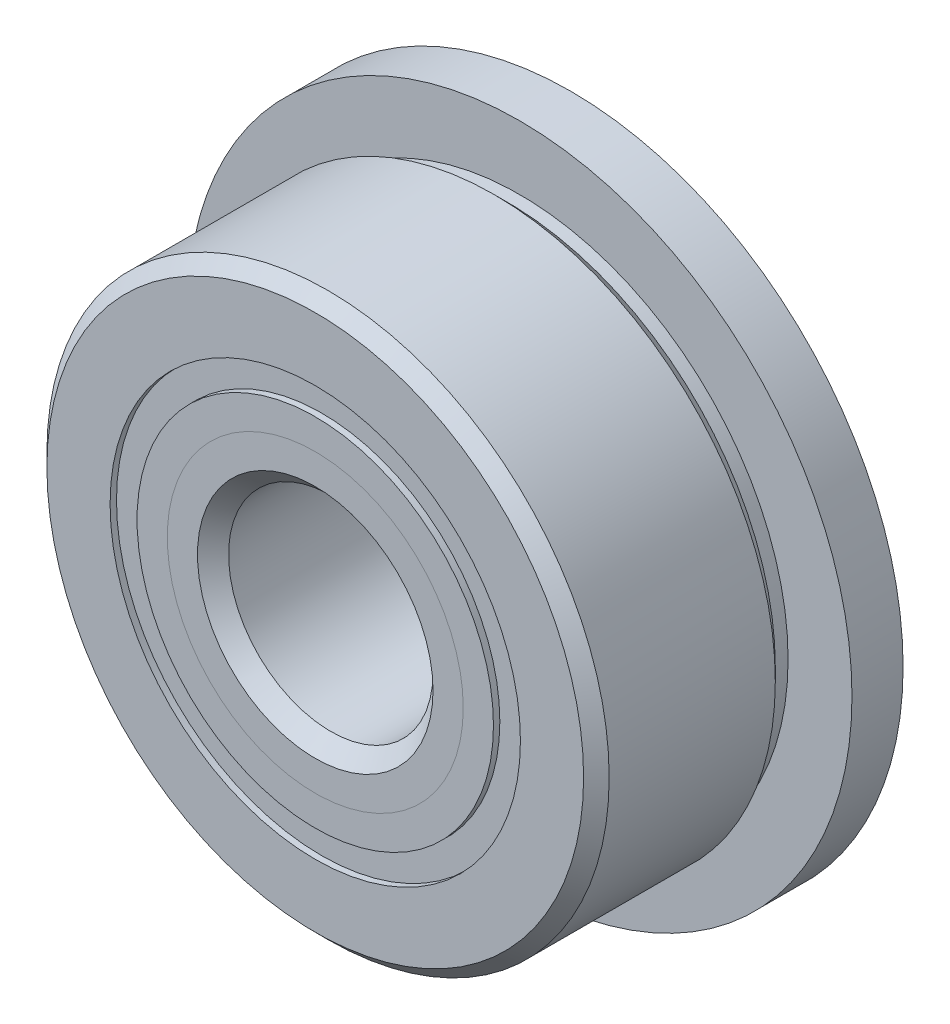
ISO-10303-21;
HEADER;
FILE_DESCRIPTION(('STEP AP214'),'2;1');
FILE_NAME('part.step','',(''),(''),'','','');
FILE_SCHEMA(('AUTOMOTIVE_DESIGN { 1 0 10303 214 1 1 1 1 }'));
ENDSEC;
DATA;
#1=APPLICATION_CONTEXT('core data for automotive mechanical design processes');
#2=APPLICATION_PROTOCOL_DEFINITION('international standard','automotive_design',2000,#1);
#3=PRODUCT_CONTEXT('',#1,'mechanical');
#4=PRODUCT('Part','Part','',(#3));
#5=PRODUCT_RELATED_PRODUCT_CATEGORY('part','',(#4));
#6=PRODUCT_DEFINITION_FORMATION('','',#4);
#7=PRODUCT_DEFINITION_CONTEXT('part definition',#1,'design');
#8=PRODUCT_DEFINITION('design','',#6,#7);
#9=PRODUCT_DEFINITION_SHAPE('','',#8);
#10=(LENGTH_UNIT() NAMED_UNIT(*) SI_UNIT(.MILLI.,.METRE.));
#11=(NAMED_UNIT(*) PLANE_ANGLE_UNIT() SI_UNIT($,.RADIAN.));
#12=(NAMED_UNIT(*) SI_UNIT($,.STERADIAN.) SOLID_ANGLE_UNIT());
#13=UNCERTAINTY_MEASURE_WITH_UNIT(LENGTH_MEASURE(1.E-05),#10,'distance_accuracy_value','');
#14=(GEOMETRIC_REPRESENTATION_CONTEXT(3) GLOBAL_UNCERTAINTY_ASSIGNED_CONTEXT((#13)) GLOBAL_UNIT_ASSIGNED_CONTEXT((#10,
#11,#12)) REPRESENTATION_CONTEXT('',''));
#15=CARTESIAN_POINT('',(0.,0.,0.));
#16=DIRECTION('',(0.,0.,1.));
#17=DIRECTION('',(1.,0.,0.));
#18=AXIS2_PLACEMENT_3D('',#15,#16,#17);
#19=CARTESIAN_POINT('',(0.,6.37180631868132,-3.7703125));
#20=DIRECTION('',(0.,0.,1.));
#21=DIRECTION('',(1.,0.,0.));
#22=AXIS2_PLACEMENT_3D('',#19,#20,#21);
#23=PLANE('',#22);
#24=CARTESIAN_POINT('',(0.,0.,-3.7703125));
#25=DIRECTION('',(0.,0.,1.));
#26=DIRECTION('',(1.,0.,0.));
#27=AXIS2_PLACEMENT_3D('',#24,#25,#26);
#28=CIRCLE('',#27,6.37180631868132);
#29=CARTESIAN_POINT('',(6.37180631868132,0.,-3.7703125));
#30=VERTEX_POINT('',#29);
#31=EDGE_CURVE('E52',#30,#30,#28,.T.);
#32=ORIENTED_EDGE('',*,*,#31,.F.);
#33=EDGE_LOOP('',(#32));
#34=FACE_BOUND('',#33,.T.);
#35=CARTESIAN_POINT('',(0.,0.,-3.7703125));
#36=DIRECTION('',(0.,0.,1.));
#37=DIRECTION('',(1.,0.,0.));
#38=AXIS2_PLACEMENT_3D('',#35,#36,#37);
#39=CIRCLE('',#38,5.53444368131869);
#40=CARTESIAN_POINT('',(5.53444368131869,0.,-3.7703125));
#41=VERTEX_POINT('',#40);
#42=EDGE_CURVE('E11',#41,#41,#39,.T.);
#43=ORIENTED_EDGE('',*,*,#42,.T.);
#44=EDGE_LOOP('',(#43));
#45=FACE_BOUND('',#44,.T.);
#46=ADVANCED_FACE('F38',(#34,#45),#23,.F.);
#47=CARTESIAN_POINT('',(0.,0.,3.96875));
#48=DIRECTION('',(0.,0.,1.));
#49=DIRECTION('',(1.,0.,0.));
#50=AXIS2_PLACEMENT_3D('',#47,#48,#49);
#51=CYLINDRICAL_SURFACE('',#50,5.53444368131869);
#52=ORIENTED_EDGE('',*,*,#42,.F.);
#53=EDGE_LOOP('',(#52));
#54=FACE_BOUND('',#53,.T.);
#55=CARTESIAN_POINT('',(0.,0.,-1.81289769677122));
#56=DIRECTION('',(0.,0.,1.));
#57=DIRECTION('',(1.,0.,0.));
#58=AXIS2_PLACEMENT_3D('',#55,#56,#57);
#59=CIRCLE('',#58,5.53444368131869);
#60=CARTESIAN_POINT('',(5.53444368131869,0.,-1.81289769677122));
#61=VERTEX_POINT('',#60);
#62=EDGE_CURVE('E44',#61,#61,#59,.T.);
#63=ORIENTED_EDGE('',*,*,#62,.T.);
#64=EDGE_LOOP('',(#63));
#65=FACE_BOUND('',#64,.T.);
#66=ADVANCED_FACE('F61',(#54,#65),#51,.F.);
#67=CARTESIAN_POINT('',(0.,6.37180631868132,-1.81289769677122));
#68=DIRECTION('',(0.,0.,-1.));
#69=DIRECTION('',(-1.,0.,0.));
#70=AXIS2_PLACEMENT_3D('',#67,#68,#69);
#71=PLANE('',#70);
#72=ORIENTED_EDGE('',*,*,#62,.F.);
#73=EDGE_LOOP('',(#72));
#74=FACE_BOUND('',#73,.T.);
#75=CARTESIAN_POINT('',(0.,0.,-1.81289769677122));
#76=DIRECTION('',(0.,0.,1.));
#77=DIRECTION('',(1.,0.,0.));
#78=AXIS2_PLACEMENT_3D('',#75,#76,#77);
#79=CIRCLE('',#78,6.37180631868132);
#80=CARTESIAN_POINT('',(6.37180631868132,0.,-1.81289769677122));
#81=VERTEX_POINT('',#80);
#82=EDGE_CURVE('E48',#81,#81,#79,.T.);
#83=ORIENTED_EDGE('',*,*,#82,.T.);
#84=EDGE_LOOP('',(#83));
#85=FACE_BOUND('',#84,.T.);
#86=ADVANCED_FACE('F65',(#74,#85),#71,.F.);
#87=CARTESIAN_POINT('',(0.,0.,3.96875));
#88=DIRECTION('',(0.,0.,1.));
#89=DIRECTION('',(1.,0.,0.));
#90=AXIS2_PLACEMENT_3D('',#87,#88,#89);
#91=CYLINDRICAL_SURFACE('',#90,6.37180631868132);
#92=ORIENTED_EDGE('',*,*,#82,.F.);
#93=EDGE_LOOP('',(#92));
#94=FACE_BOUND('',#93,.T.);
#95=ORIENTED_EDGE('',*,*,#31,.T.);
#96=EDGE_LOOP('',(#95));
#97=FACE_BOUND('',#96,.T.);
#98=ADVANCED_FACE('F58',(#94,#97),#91,.T.);
#99=CLOSED_SHELL('',(#46,#66,#86,#98));
#100=MANIFOLD_SOLID_BREP('B2',#99);
#101=CARTESIAN_POINT('',(0.,6.37180631868132,3.7703125));
#102=DIRECTION('',(0.,0.,-1.));
#103=DIRECTION('',(-1.,0.,0.));
#104=AXIS2_PLACEMENT_3D('',#101,#102,#103);
#105=PLANE('',#104);
#106=CARTESIAN_POINT('',(0.,0.,3.7703125));
#107=DIRECTION('',(0.,0.,1.));
#108=DIRECTION('',(1.,0.,0.));
#109=AXIS2_PLACEMENT_3D('',#106,#107,#108);
#110=CIRCLE('',#109,5.53444368131869);
#111=CARTESIAN_POINT('',(5.53444368131869,0.,3.7703125));
#112=VERTEX_POINT('',#111);
#113=EDGE_CURVE('E37',#112,#112,#110,.T.);
#114=ORIENTED_EDGE('',*,*,#113,.F.);
#115=EDGE_LOOP('',(#114));
#116=FACE_BOUND('',#115,.T.);
#117=CARTESIAN_POINT('',(0.,0.,3.7703125));
#118=DIRECTION('',(0.,0.,1.));
#119=DIRECTION('',(1.,0.,0.));
#120=AXIS2_PLACEMENT_3D('',#117,#118,#119);
#121=CIRCLE('',#120,6.37180631868132);
#122=CARTESIAN_POINT('',(6.37180631868132,0.,3.7703125));
#123=VERTEX_POINT('',#122);
#124=EDGE_CURVE('E120',#123,#123,#121,.T.);
#125=ORIENTED_EDGE('',*,*,#124,.T.);
#126=EDGE_LOOP('',(#125));
#127=FACE_BOUND('',#126,.T.);
#128=ADVANCED_FACE('F106',(#116,#127),#105,.F.);
#129=CARTESIAN_POINT('',(0.,0.,3.96875));
#130=DIRECTION('',(0.,0.,1.));
#131=DIRECTION('',(1.,0.,0.));
#132=AXIS2_PLACEMENT_3D('',#129,#130,#131);
#133=CYLINDRICAL_SURFACE('',#132,5.53444368131869);
#134=CARTESIAN_POINT('',(0.,0.,1.81289769677122));
#135=DIRECTION('',(0.,0.,1.));
#136=DIRECTION('',(1.,0.,0.));
#137=AXIS2_PLACEMENT_3D('',#134,#135,#136);
#138=CIRCLE('',#137,5.53444368131869);
#139=CARTESIAN_POINT('',(5.53444368131869,0.,1.81289769677122));
#140=VERTEX_POINT('',#139);
#141=EDGE_CURVE('E112',#140,#140,#138,.T.);
#142=ORIENTED_EDGE('',*,*,#141,.F.);
#143=EDGE_LOOP('',(#142));
#144=FACE_BOUND('',#143,.T.);
#145=ORIENTED_EDGE('',*,*,#113,.T.);
#146=EDGE_LOOP('',(#145));
#147=FACE_BOUND('',#146,.T.);
#148=ADVANCED_FACE('F135',(#144,#147),#133,.F.);
#149=CARTESIAN_POINT('',(0.,6.37180631868132,1.81289769677122));
#150=DIRECTION('',(0.,0.,1.));
#151=DIRECTION('',(1.,0.,0.));
#152=AXIS2_PLACEMENT_3D('',#149,#150,#151);
#153=PLANE('',#152);
#154=CARTESIAN_POINT('',(0.,0.,1.81289769677122));
#155=DIRECTION('',(0.,0.,1.));
#156=DIRECTION('',(1.,0.,0.));
#157=AXIS2_PLACEMENT_3D('',#154,#155,#156);
#158=CIRCLE('',#157,6.37180631868132);
#159=CARTESIAN_POINT('',(6.37180631868132,0.,1.81289769677122));
#160=VERTEX_POINT('',#159);
#161=EDGE_CURVE('E116',#160,#160,#158,.T.);
#162=ORIENTED_EDGE('',*,*,#161,.F.);
#163=EDGE_LOOP('',(#162));
#164=FACE_BOUND('',#163,.T.);
#165=ORIENTED_EDGE('',*,*,#141,.T.);
#166=EDGE_LOOP('',(#165));
#167=FACE_BOUND('',#166,.T.);
#168=ADVANCED_FACE('F130',(#164,#167),#153,.F.);
#169=CARTESIAN_POINT('',(0.,0.,3.96875));
#170=DIRECTION('',(0.,0.,1.));
#171=DIRECTION('',(1.,0.,0.));
#172=AXIS2_PLACEMENT_3D('',#169,#170,#171);
#173=CYLINDRICAL_SURFACE('',#172,6.37180631868132);
#174=ORIENTED_EDGE('',*,*,#124,.F.);
#175=EDGE_LOOP('',(#174));
#176=FACE_BOUND('',#175,.T.);
#177=ORIENTED_EDGE('',*,*,#161,.T.);
#178=EDGE_LOOP('',(#177));
#179=FACE_BOUND('',#178,.T.);
#180=ADVANCED_FACE('F127',(#176,#179),#173,.T.);
#181=CLOSED_SHELL('',(#128,#148,#168,#180));
#182=MANIFOLD_SOLID_BREP('B6',#181);
#183=CARTESIAN_POINT('',(-3.49915908005357,4.81617929463841,0.));
#184=DIRECTION('',(0.,0.,1.));
#185=DIRECTION('',(-0.587785252292462,0.809016994374955,0.));
#186=AXIS2_PLACEMENT_3D('',#183,#184,#185);
#187=SPHERICAL_SURFACE('',#186,1.81289769677122);
#188=CARTESIAN_POINT('',(-3.49915908005357,4.81617929463841,1.81289769677122));
#189=VERTEX_POINT('',#188);
#190=VERTEX_LOOP('',#189);
#191=FACE_BOUND('',#190,.T.);
#192=ADVANCED_FACE('F174',(#191),#187,.T.);
#193=CLOSED_SHELL('',(#192));
#194=MANIFOLD_SOLID_BREP('B32',#193);
#195=CARTESIAN_POINT('',(-5.66175832356957,1.83961679463842,0.));
#196=DIRECTION('',(0.,0.,1.));
#197=DIRECTION('',(-0.95105651629515,0.309016994374958,0.));
#198=AXIS2_PLACEMENT_3D('',#195,#196,#197);
#199=SPHERICAL_SURFACE('',#198,1.81289769677122);
#200=CARTESIAN_POINT('',(-5.66175832356957,1.83961679463842,1.81289769677122));
#201=VERTEX_POINT('',#200);
#202=VERTEX_LOOP('',#201);
#203=FACE_BOUND('',#202,.T.);
#204=ADVANCED_FACE('F193',(#203),#199,.T.);
#205=CLOSED_SHELL('',(#204));
#206=MANIFOLD_SOLID_BREP('B102',#205);
#207=CARTESIAN_POINT('',(-5.6617583235696,-1.8396167946383,0.));
#208=DIRECTION('',(0.,0.,1.));
#209=DIRECTION('',(-0.951056516295157,-0.309016994374938,0.));
#210=AXIS2_PLACEMENT_3D('',#207,#208,#209);
#211=SPHERICAL_SURFACE('',#210,1.81289769677122);
#212=CARTESIAN_POINT('',(-5.6617583235696,-1.8396167946383,1.81289769677122));
#213=VERTEX_POINT('',#212);
#214=VERTEX_LOOP('',#213);
#215=FACE_BOUND('',#214,.T.);
#216=ADVANCED_FACE('F212',(#215),#211,.T.);
#217=CLOSED_SHELL('',(#216));
#218=MANIFOLD_SOLID_BREP('B170',#217);
#219=CARTESIAN_POINT('',(-3.49915908005367,-4.81617929463833,0.));
#220=DIRECTION('',(0.,0.,1.));
#221=DIRECTION('',(-0.58778525229248,-0.809016994374942,0.));
#222=AXIS2_PLACEMENT_3D('',#219,#220,#221);
#223=SPHERICAL_SURFACE('',#222,1.81289769677122);
#224=CARTESIAN_POINT('',(-3.49915908005367,-4.81617929463833,1.81289769677122));
#225=VERTEX_POINT('',#224);
#226=VERTEX_LOOP('',#225);
#227=FACE_BOUND('',#226,.T.);
#228=ADVANCED_FACE('F231',(#227),#223,.T.);
#229=CLOSED_SHELL('',(#228));
#230=MANIFOLD_SOLID_BREP('B189',#229);
#231=CARTESIAN_POINT('',(0.,-5.953125,0.));
#232=DIRECTION('',(0.,0.,1.));
#233=DIRECTION('',(0.,-1.,0.));
#234=AXIS2_PLACEMENT_3D('',#231,#232,#233);
#235=SPHERICAL_SURFACE('',#234,1.81289769677122);
#236=CARTESIAN_POINT('',(0.,-5.953125,1.81289769677122));
#237=VERTEX_POINT('',#236);
#238=VERTEX_LOOP('',#237);
#239=FACE_BOUND('',#238,.T.);
#240=ADVANCED_FACE('F250',(#239),#235,.T.);
#241=CLOSED_SHELL('',(#240));
#242=MANIFOLD_SOLID_BREP('B208',#241);
#243=CARTESIAN_POINT('',(3.4991590800536,-4.81617929463838,0.));
#244=DIRECTION('',(0.,0.,1.));
#245=DIRECTION('',(0.587785252292469,-0.809016994374951,0.));
#246=AXIS2_PLACEMENT_3D('',#243,#244,#245);
#247=SPHERICAL_SURFACE('',#246,1.81289769677122);
#248=CARTESIAN_POINT('',(3.4991590800536,-4.81617929463838,1.81289769677122));
#249=VERTEX_POINT('',#248);
#250=VERTEX_LOOP('',#249);
#251=FACE_BOUND('',#250,.T.);
#252=ADVANCED_FACE('F269',(#251),#247,.T.);
#253=CLOSED_SHELL('',(#252));
#254=MANIFOLD_SOLID_BREP('B227',#253);
#255=CARTESIAN_POINT('',(5.66175832356958,-1.83961679463838,0.));
#256=DIRECTION('',(0.,0.,1.));
#257=DIRECTION('',(0.951056516295152,-0.309016994374952,0.));
#258=AXIS2_PLACEMENT_3D('',#255,#256,#257);
#259=SPHERICAL_SURFACE('',#258,1.81289769677122);
#260=CARTESIAN_POINT('',(5.66175832356958,-1.83961679463838,1.81289769677122));
#261=VERTEX_POINT('',#260);
#262=VERTEX_LOOP('',#261);
#263=FACE_BOUND('',#262,.T.);
#264=ADVANCED_FACE('F288',(#263),#259,.T.);
#265=CLOSED_SHELL('',(#264));
#266=MANIFOLD_SOLID_BREP('B246',#265);
#267=CARTESIAN_POINT('',(5.66175832356959,1.83961679463834,0.));
#268=DIRECTION('',(0.,0.,1.));
#269=DIRECTION('',(0.951056516295155,0.309016994374945,0.));
#270=AXIS2_PLACEMENT_3D('',#267,#268,#269);
#271=SPHERICAL_SURFACE('',#270,1.81289769677122);
#272=CARTESIAN_POINT('',(5.66175832356959,1.83961679463834,1.81289769677122));
#273=VERTEX_POINT('',#272);
#274=VERTEX_LOOP('',#273);
#275=FACE_BOUND('',#274,.T.);
#276=ADVANCED_FACE('F307',(#275),#271,.T.);
#277=CLOSED_SHELL('',(#276));
#278=MANIFOLD_SOLID_BREP('B265',#277);
#279=CARTESIAN_POINT('',(3.49915908005364,4.81617929463835,0.));
#280=DIRECTION('',(0.,0.,1.));
#281=DIRECTION('',(0.587785252292474,0.809016994374947,0.));
#282=AXIS2_PLACEMENT_3D('',#279,#280,#281);
#283=SPHERICAL_SURFACE('',#282,1.81289769677122);
#284=CARTESIAN_POINT('',(3.49915908005364,4.81617929463835,1.81289769677122));
#285=VERTEX_POINT('',#284);
#286=VERTEX_LOOP('',#285);
#287=FACE_BOUND('',#286,.T.);
#288=ADVANCED_FACE('F326',(#287),#283,.T.);
#289=CLOSED_SHELL('',(#288));
#290=MANIFOLD_SOLID_BREP('B284',#289);
#291=CARTESIAN_POINT('',(0.,5.953125,0.));
#292=DIRECTION('',(0.,0.,1.));
#293=DIRECTION('',(0.,1.,0.));
#294=AXIS2_PLACEMENT_3D('',#291,#292,#293);
#295=SPHERICAL_SURFACE('',#294,1.81289769677122);
#296=CARTESIAN_POINT('',(0.,5.953125,1.81289769677122));
#297=VERTEX_POINT('',#296);
#298=VERTEX_LOOP('',#297);
#299=FACE_BOUND('',#298,.T.);
#300=ADVANCED_FACE('F347',(#299),#295,.T.);
#301=CLOSED_SHELL('',(#300));
#302=MANIFOLD_SOLID_BREP('B303',#301);
#303=CARTESIAN_POINT('',(0.,4.59602866646654,3.96875));
#304=DIRECTION('',(0.,0.,-1.));
#305=DIRECTION('',(-1.,0.,0.));
#306=AXIS2_PLACEMENT_3D('',#303,#304,#305);
#307=PLANE('',#306);
#308=CARTESIAN_POINT('',(0.,0.,3.96875));
#309=DIRECTION('',(0.,0.,1.));
#310=DIRECTION('',(1.,0.,0.));
#311=AXIS2_PLACEMENT_3D('',#308,#309,#310);
#312=CIRCLE('',#311,3.65761365161439);
#313=CARTESIAN_POINT('',(3.65761365161439,0.,3.96875));
#314=VERTEX_POINT('',#313);
#315=EDGE_CURVE('E402',#314,#314,#312,.T.);
#316=ORIENTED_EDGE('',*,*,#315,.F.);
#317=EDGE_LOOP('',(#316));
#318=FACE_BOUND('',#317,.T.);
#319=CARTESIAN_POINT('',(0.,0.,3.96875));
#320=DIRECTION('',(0.,0.,1.));
#321=DIRECTION('',(1.,0.,0.));
#322=AXIS2_PLACEMENT_3D('',#319,#320,#321);
#323=CIRCLE('',#322,4.59602866646654);
#324=CARTESIAN_POINT('',(4.59602866646654,0.,3.96875));
#325=VERTEX_POINT('',#324);
#326=EDGE_CURVE('E346',#325,#325,#323,.T.);
#327=ORIENTED_EDGE('',*,*,#326,.T.);
#328=EDGE_LOOP('',(#327));
#329=FACE_BOUND('',#328,.T.);
#330=ADVANCED_FACE('F368',(#318,#329),#307,.F.);
#331=CARTESIAN_POINT('',(0.,0.,3.03033498514785));
#332=DIRECTION('',(0.,0.,1.));
#333=DIRECTION('',(1.,0.,0.));
#334=AXIS2_PLACEMENT_3D('',#331,#332,#333);
#335=CONICAL_SURFACE('',#334,3.65761365161439,0.78539816339745);
#336=ORIENTED_EDGE('',*,*,#326,.F.);
#337=EDGE_LOOP('',(#336));
#338=FACE_BOUND('',#337,.T.);
#339=CARTESIAN_POINT('',(0.,0.,3.03033498514785));
#340=DIRECTION('',(0.,0.,1.));
#341=DIRECTION('',(1.,0.,0.));
#342=AXIS2_PLACEMENT_3D('',#339,#340,#341);
#343=CIRCLE('',#342,3.65761365161439);
#344=CARTESIAN_POINT('',(3.65761365161439,0.,3.03033498514785));
#345=VERTEX_POINT('',#344);
#346=EDGE_CURVE('E374',#345,#345,#343,.T.);
#347=ORIENTED_EDGE('',*,*,#346,.T.);
#348=EDGE_LOOP('',(#347));
#349=FACE_BOUND('',#348,.T.);
#350=ADVANCED_FACE('F409',(#338,#349),#335,.T.);
#351=CARTESIAN_POINT('',(0.,0.,3.96875));
#352=DIRECTION('',(0.,0.,1.));
#353=DIRECTION('',(1.,0.,0.));
#354=AXIS2_PLACEMENT_3D('',#351,#352,#353);
#355=CYLINDRICAL_SURFACE('',#354,3.65761365161439);
#356=ORIENTED_EDGE('',*,*,#346,.F.);
#357=EDGE_LOOP('',(#356));
#358=FACE_BOUND('',#357,.T.);
#359=CARTESIAN_POINT('',(0.,0.,0.));
#360=DIRECTION('',(0.,0.,1.));
#361=DIRECTION('',(1.,0.,0.));
#362=AXIS2_PLACEMENT_3D('',#359,#360,#361);
#363=CIRCLE('',#362,3.65761365161439);
#364=CARTESIAN_POINT('',(3.65761365161439,0.,0.));
#365=VERTEX_POINT('',#364);
#366=EDGE_CURVE('E378',#365,#365,#363,.T.);
#367=ORIENTED_EDGE('',*,*,#366,.T.);
#368=EDGE_LOOP('',(#367));
#369=FACE_BOUND('',#368,.T.);
#370=ADVANCED_FACE('F413',(#358,#369),#355,.T.);
#371=CARTESIAN_POINT('',(0.,3.65761365161439,0.));
#372=DIRECTION('',(0.,0.,-1.));
#373=DIRECTION('',(-1.,0.,0.));
#374=AXIS2_PLACEMENT_3D('',#371,#372,#373);
#375=PLANE('',#374);
#376=ORIENTED_EDGE('',*,*,#366,.F.);
#377=EDGE_LOOP('',(#376));
#378=FACE_BOUND('',#377,.T.);
#379=CARTESIAN_POINT('',(0.,0.,0.));
#380=DIRECTION('',(0.,0.,1.));
#381=DIRECTION('',(1.,0.,0.));
#382=AXIS2_PLACEMENT_3D('',#379,#380,#381);
#383=CIRCLE('',#382,4.14022730322878);
#384=CARTESIAN_POINT('',(4.14022730322878,0.,0.));
#385=VERTEX_POINT('',#384);
#386=EDGE_CURVE('E382',#385,#385,#383,.T.);
#387=ORIENTED_EDGE('',*,*,#386,.T.);
#388=EDGE_LOOP('',(#387));
#389=FACE_BOUND('',#388,.T.);
#390=ADVANCED_FACE('F418',(#378,#389),#375,.F.);
#391=CARTESIAN_POINT('',(0.,0.,0.));
#392=DIRECTION('',(0.,0.,1.));
#393=DIRECTION('',(1.,0.,0.));
#394=AXIS2_PLACEMENT_3D('',#391,#392,#393);
#395=TOROIDAL_SURFACE('',#394,5.953125,1.81289769677122);
#396=ORIENTED_EDGE('',*,*,#386,.F.);
#397=EDGE_LOOP('',(#396));
#398=FACE_BOUND('',#397,.T.);
#399=CARTESIAN_POINT('',(0.,0.,-1.76388888888889));
#400=DIRECTION('',(0.,0.,1.));
#401=DIRECTION('',(1.,0.,0.));
#402=AXIS2_PLACEMENT_3D('',#399,#400,#401);
#403=CIRCLE('',#402,5.53444368131869);
#404=CARTESIAN_POINT('',(5.53444368131869,0.,-1.76388888888889));
#405=VERTEX_POINT('',#404);
#406=EDGE_CURVE('E387',#405,#405,#403,.T.);
#407=ORIENTED_EDGE('',*,*,#406,.T.);
#408=EDGE_LOOP('',(#407));
#409=FACE_BOUND('',#408,.T.);
#410=ADVANCED_FACE('F424',(#398,#409),#395,.F.);
#411=CARTESIAN_POINT('',(0.,0.,3.96875));
#412=DIRECTION('',(0.,0.,1.));
#413=DIRECTION('',(1.,0.,0.));
#414=AXIS2_PLACEMENT_3D('',#411,#412,#413);
#415=CYLINDRICAL_SURFACE('',#414,5.53444368131869);
#416=ORIENTED_EDGE('',*,*,#406,.F.);
#417=EDGE_LOOP('',(#416));
#418=FACE_BOUND('',#417,.T.);
#419=CARTESIAN_POINT('',(0.,0.,-5.55625));
#420=DIRECTION('',(0.,0.,1.));
#421=DIRECTION('',(1.,0.,0.));
#422=AXIS2_PLACEMENT_3D('',#419,#420,#421);
#423=CIRCLE('',#422,5.53444368131869);
#424=CARTESIAN_POINT('',(5.53444368131869,0.,-5.55625));
#425=VERTEX_POINT('',#424);
#426=EDGE_CURVE('E390',#425,#425,#423,.T.);
#427=ORIENTED_EDGE('',*,*,#426,.T.);
#428=EDGE_LOOP('',(#427));
#429=FACE_BOUND('',#428,.T.);
#430=ADVANCED_FACE('F428',(#418,#429),#415,.T.);
#431=CARTESIAN_POINT('',(0.,3.571875,-5.55625));
#432=DIRECTION('',(0.,0.,1.));
#433=DIRECTION('',(1.,0.,0.));
#434=AXIS2_PLACEMENT_3D('',#431,#432,#433);
#435=PLANE('',#434);
#436=ORIENTED_EDGE('',*,*,#426,.F.);
#437=EDGE_LOOP('',(#436));
#438=FACE_BOUND('',#437,.T.);
#439=CARTESIAN_POINT('',(0.,0.,-5.55625));
#440=DIRECTION('',(0.,0.,1.));
#441=DIRECTION('',(1.,0.,0.));
#442=AXIS2_PLACEMENT_3D('',#439,#440,#441);
#443=CIRCLE('',#442,3.571875);
#444=CARTESIAN_POINT('',(3.571875,0.,-5.55625));
#445=VERTEX_POINT('',#444);
#446=EDGE_CURVE('E393',#445,#445,#443,.T.);
#447=ORIENTED_EDGE('',*,*,#446,.T.);
#448=EDGE_LOOP('',(#447));
#449=FACE_BOUND('',#448,.T.);
#450=ADVANCED_FACE('F432',(#438,#449),#435,.F.);
#451=CARTESIAN_POINT('',(0.,0.,-5.159375));
#452=DIRECTION('',(0.,0.,-1.));
#453=DIRECTION('',(-1.,0.,0.));
#454=AXIS2_PLACEMENT_3D('',#451,#452,#453);
#455=CONICAL_SURFACE('',#454,3.175,0.785398163397448);
#456=ORIENTED_EDGE('',*,*,#446,.F.);
#457=EDGE_LOOP('',(#456));
#458=FACE_BOUND('',#457,.T.);
#459=CARTESIAN_POINT('',(0.,0.,-5.159375));
#460=DIRECTION('',(0.,0.,1.));
#461=DIRECTION('',(1.,0.,0.));
#462=AXIS2_PLACEMENT_3D('',#459,#460,#461);
#463=CIRCLE('',#462,3.175);
#464=CARTESIAN_POINT('',(3.175,0.,-5.159375));
#465=VERTEX_POINT('',#464);
#466=EDGE_CURVE('E396',#465,#465,#463,.T.);
#467=ORIENTED_EDGE('',*,*,#466,.T.);
#468=EDGE_LOOP('',(#467));
#469=FACE_BOUND('',#468,.T.);
#470=ADVANCED_FACE('F436',(#458,#469),#455,.F.);
#471=CARTESIAN_POINT('',(0.,0.,3.96875));
#472=DIRECTION('',(0.,0.,1.));
#473=DIRECTION('',(1.,0.,0.));
#474=AXIS2_PLACEMENT_3D('',#471,#472,#473);
#475=CYLINDRICAL_SURFACE('',#474,3.175);
#476=ORIENTED_EDGE('',*,*,#466,.F.);
#477=EDGE_LOOP('',(#476));
#478=FACE_BOUND('',#477,.T.);
#479=CARTESIAN_POINT('',(0.,0.,3.48613634838561));
#480=DIRECTION('',(0.,0.,1.));
#481=DIRECTION('',(1.,0.,0.));
#482=AXIS2_PLACEMENT_3D('',#479,#480,#481);
#483=CIRCLE('',#482,3.175);
#484=CARTESIAN_POINT('',(3.175,0.,3.48613634838561));
#485=VERTEX_POINT('',#484);
#486=EDGE_CURVE('E399',#485,#485,#483,.T.);
#487=ORIENTED_EDGE('',*,*,#486,.T.);
#488=EDGE_LOOP('',(#487));
#489=FACE_BOUND('',#488,.T.);
#490=ADVANCED_FACE('F440',(#478,#489),#475,.F.);
#491=CARTESIAN_POINT('',(0.,0.,3.96875));
#492=DIRECTION('',(0.,0.,1.));
#493=DIRECTION('',(1.,0.,0.));
#494=AXIS2_PLACEMENT_3D('',#491,#492,#493);
#495=CONICAL_SURFACE('',#494,3.65761365161439,0.785398163397448);
#496=ORIENTED_EDGE('',*,*,#486,.F.);
#497=EDGE_LOOP('',(#496));
#498=FACE_BOUND('',#497,.T.);
#499=ORIENTED_EDGE('',*,*,#315,.T.);
#500=EDGE_LOOP('',(#499));
#501=FACE_BOUND('',#500,.T.);
#502=ADVANCED_FACE('F406',(#498,#501),#495,.F.);
#503=CLOSED_SHELL('',(#330,#350,#370,#390,#410,#430,#450,#470,#490,#502));
#504=MANIFOLD_SOLID_BREP('B322',#503);
#505=CARTESIAN_POINT('',(0.,5.53444368131869,3.96875));
#506=DIRECTION('',(0.,0.,-1.));
#507=DIRECTION('',(-1.,0.,0.));
#508=AXIS2_PLACEMENT_3D('',#505,#506,#507);
#509=PLANE('',#508);
#510=CARTESIAN_POINT('',(0.,0.,3.96875));
#511=DIRECTION('',(0.,0.,1.));
#512=DIRECTION('',(1.,0.,0.));
#513=AXIS2_PLACEMENT_3D('',#510,#511,#512);
#514=CIRCLE('',#513,4.59602866646654);
#515=CARTESIAN_POINT('',(4.59602866646654,0.,3.96875));
#516=VERTEX_POINT('',#515);
#517=EDGE_CURVE('E367',#516,#516,#514,.T.);
#518=ORIENTED_EDGE('',*,*,#517,.F.);
#519=EDGE_LOOP('',(#518));
#520=FACE_BOUND('',#519,.T.);
#521=CARTESIAN_POINT('',(0.,0.,3.96875));
#522=DIRECTION('',(0.,0.,1.));
#523=DIRECTION('',(1.,0.,0.));
#524=AXIS2_PLACEMENT_3D('',#521,#522,#523);
#525=CIRCLE('',#524,5.53444368131869);
#526=CARTESIAN_POINT('',(5.53444368131869,0.,3.96875));
#527=VERTEX_POINT('',#526);
#528=EDGE_CURVE('E549',#527,#527,#525,.T.);
#529=ORIENTED_EDGE('',*,*,#528,.T.);
#530=EDGE_LOOP('',(#529));
#531=FACE_BOUND('',#530,.T.);
#532=ADVANCED_FACE('F527',(#520,#531),#509,.F.);
#533=CARTESIAN_POINT('',(0.,0.,3.96875));
#534=DIRECTION('',(0.,0.,1.));
#535=DIRECTION('',(1.,0.,0.));
#536=AXIS2_PLACEMENT_3D('',#533,#534,#535);
#537=CONICAL_SURFACE('',#536,4.59602866646654,0.78539816339745);
#538=CARTESIAN_POINT('',(0.,0.,3.03033498514785));
#539=DIRECTION('',(0.,0.,1.));
#540=DIRECTION('',(1.,0.,0.));
#541=AXIS2_PLACEMENT_3D('',#538,#539,#540);
#542=CIRCLE('',#541,3.65761365161439);
#543=CARTESIAN_POINT('',(3.65761365161439,0.,3.03033498514785));
#544=VERTEX_POINT('',#543);
#545=EDGE_CURVE('E533',#544,#544,#542,.T.);
#546=ORIENTED_EDGE('',*,*,#545,.F.);
#547=EDGE_LOOP('',(#546));
#548=FACE_BOUND('',#547,.T.);
#549=ORIENTED_EDGE('',*,*,#517,.T.);
#550=EDGE_LOOP('',(#549));
#551=FACE_BOUND('',#550,.T.);
#552=ADVANCED_FACE('F574',(#548,#551),#537,.F.);
#553=CARTESIAN_POINT('',(0.,0.,3.96875));
#554=DIRECTION('',(0.,0.,1.));
#555=DIRECTION('',(1.,0.,0.));
#556=AXIS2_PLACEMENT_3D('',#553,#554,#555);
#557=CYLINDRICAL_SURFACE('',#556,3.65761365161439);
#558=CARTESIAN_POINT('',(0.,0.,0.));
#559=DIRECTION('',(0.,0.,1.));
#560=DIRECTION('',(1.,0.,0.));
#561=AXIS2_PLACEMENT_3D('',#558,#559,#560);
#562=CIRCLE('',#561,3.65761365161439);
#563=CARTESIAN_POINT('',(3.65761365161439,0.,0.));
#564=VERTEX_POINT('',#563);
#565=EDGE_CURVE('E537',#564,#564,#562,.T.);
#566=ORIENTED_EDGE('',*,*,#565,.F.);
#567=EDGE_LOOP('',(#566));
#568=FACE_BOUND('',#567,.T.);
#569=ORIENTED_EDGE('',*,*,#545,.T.);
#570=EDGE_LOOP('',(#569));
#571=FACE_BOUND('',#570,.T.);
#572=ADVANCED_FACE('F569',(#568,#571),#557,.F.);
#573=CARTESIAN_POINT('',(0.,3.65761365161439,0.));
#574=DIRECTION('',(0.,0.,1.));
#575=DIRECTION('',(1.,0.,0.));
#576=AXIS2_PLACEMENT_3D('',#573,#574,#575);
#577=PLANE('',#576);
#578=CARTESIAN_POINT('',(0.,0.,0.));
#579=DIRECTION('',(0.,0.,1.));
#580=DIRECTION('',(1.,0.,0.));
#581=AXIS2_PLACEMENT_3D('',#578,#579,#580);
#582=CIRCLE('',#581,4.14022730322878);
#583=CARTESIAN_POINT('',(4.14022730322878,0.,0.));
#584=VERTEX_POINT('',#583);
#585=EDGE_CURVE('E541',#584,#584,#582,.T.);
#586=ORIENTED_EDGE('',*,*,#585,.F.);
#587=EDGE_LOOP('',(#586));
#588=FACE_BOUND('',#587,.T.);
#589=ORIENTED_EDGE('',*,*,#565,.T.);
#590=EDGE_LOOP('',(#589));
#591=FACE_BOUND('',#590,.T.);
#592=ADVANCED_FACE('F563',(#588,#591),#577,.F.);
#593=CARTESIAN_POINT('',(0.,0.,0.));
#594=DIRECTION('',(0.,0.,1.));
#595=DIRECTION('',(1.,0.,0.));
#596=AXIS2_PLACEMENT_3D('',#593,#594,#595);
#597=TOROIDAL_SURFACE('',#596,5.953125,1.81289769677122);
#598=CARTESIAN_POINT('',(0.,0.,1.76388888888889));
#599=DIRECTION('',(0.,0.,1.));
#600=DIRECTION('',(1.,0.,0.));
#601=AXIS2_PLACEMENT_3D('',#598,#599,#600);
#602=CIRCLE('',#601,5.53444368131869);
#603=CARTESIAN_POINT('',(5.53444368131869,0.,1.76388888888889));
#604=VERTEX_POINT('',#603);
#605=EDGE_CURVE('E546',#604,#604,#602,.T.);
#606=ORIENTED_EDGE('',*,*,#605,.F.);
#607=EDGE_LOOP('',(#606));
#608=FACE_BOUND('',#607,.T.);
#609=ORIENTED_EDGE('',*,*,#585,.T.);
#610=EDGE_LOOP('',(#609));
#611=FACE_BOUND('',#610,.T.);
#612=ADVANCED_FACE('F557',(#608,#611),#597,.F.);
#613=CARTESIAN_POINT('',(0.,0.,3.96875));
#614=DIRECTION('',(0.,0.,1.));
#615=DIRECTION('',(1.,0.,0.));
#616=AXIS2_PLACEMENT_3D('',#613,#614,#615);
#617=CYLINDRICAL_SURFACE('',#616,5.53444368131869);
#618=ORIENTED_EDGE('',*,*,#528,.F.);
#619=EDGE_LOOP('',(#618));
#620=FACE_BOUND('',#619,.T.);
#621=ORIENTED_EDGE('',*,*,#605,.T.);
#622=EDGE_LOOP('',(#621));
#623=FACE_BOUND('',#622,.T.);
#624=ADVANCED_FACE('F554',(#620,#623),#617,.T.);
#625=CLOSED_SHELL('',(#532,#552,#572,#592,#612,#624));
#626=MANIFOLD_SOLID_BREP('B341',#625);
#627=CARTESIAN_POINT('',(0.,0.,3.96875));
#628=DIRECTION('',(0.,0.,1.));
#629=DIRECTION('',(1.,0.,0.));
#630=AXIS2_PLACEMENT_3D('',#627,#628,#629);
#631=CYLINDRICAL_SURFACE('',#630,8.73125);
#632=CARTESIAN_POINT('',(0.,0.,3.571875));
#633=DIRECTION('',(0.,0.,1.));
#634=DIRECTION('',(1.,0.,0.));
#635=AXIS2_PLACEMENT_3D('',#632,#633,#634);
#636=CIRCLE('',#635,8.73125);
#637=CARTESIAN_POINT('',(8.73125,0.,3.571875));
#638=VERTEX_POINT('',#637);
#639=EDGE_CURVE('E526',#638,#638,#636,.T.);
#640=ORIENTED_EDGE('',*,*,#639,.F.);
#641=EDGE_LOOP('',(#640));
#642=FACE_BOUND('',#641,.T.);
#643=CARTESIAN_POINT('',(0.,0.,-1.5875));
#644=DIRECTION('',(0.,0.,1.));
#645=DIRECTION('',(1.,0.,0.));
#646=AXIS2_PLACEMENT_3D('',#643,#644,#645);
#647=CIRCLE('',#646,8.73125);
#648=CARTESIAN_POINT('',(8.73125,0.,-1.5875));
#649=VERTEX_POINT('',#648);
#650=EDGE_CURVE('E657',#649,#649,#647,.T.);
#651=ORIENTED_EDGE('',*,*,#650,.T.);
#652=EDGE_LOOP('',(#651));
#653=FACE_BOUND('',#652,.T.);
#654=ADVANCED_FACE('F619',(#642,#653),#631,.T.);
#655=CARTESIAN_POINT('',(0.,0.,3.571875));
#656=DIRECTION('',(0.,0.,-1.));
#657=DIRECTION('',(-1.,0.,0.));
#658=AXIS2_PLACEMENT_3D('',#655,#656,#657);
#659=CONICAL_SURFACE('',#658,8.73125,0.785398163397446);
#660=CARTESIAN_POINT('',(0.,0.,3.96875));
#661=DIRECTION('',(0.,0.,1.));
#662=DIRECTION('',(1.,0.,0.));
#663=AXIS2_PLACEMENT_3D('',#660,#661,#662);
#664=CIRCLE('',#663,8.334375);
#665=CARTESIAN_POINT('',(8.334375,0.,3.96875));
#666=VERTEX_POINT('',#665);
#667=EDGE_CURVE('E642',#666,#666,#664,.T.);
#668=ORIENTED_EDGE('',*,*,#667,.F.);
#669=EDGE_LOOP('',(#668));
#670=FACE_BOUND('',#669,.T.);
#671=ORIENTED_EDGE('',*,*,#639,.T.);
#672=EDGE_LOOP('',(#671));
#673=FACE_BOUND('',#672,.T.);
#674=ADVANCED_FACE('F621',(#670,#673),#659,.T.);
#675=CARTESIAN_POINT('',(0.,8.334375,-3.96875));
#676=DIRECTION('',(0.,0.,1.));
#677=DIRECTION('',(1.,0.,0.));
#678=AXIS2_PLACEMENT_3D('',#675,#676,#677);
#679=PLANE('',#678);
#680=CARTESIAN_POINT('',(0.,0.,-3.96875));
#681=DIRECTION('',(0.,0.,1.));
#682=DIRECTION('',(1.,0.,0.));
#683=AXIS2_PLACEMENT_3D('',#680,#681,#682);
#684=CIRCLE('',#683,6.37180631868132);
#685=CARTESIAN_POINT('',(6.37180631868132,0.,-3.96875));
#686=VERTEX_POINT('',#685);
#687=EDGE_CURVE('E626',#686,#686,#684,.T.);
#688=ORIENTED_EDGE('',*,*,#687,.T.);
#689=EDGE_LOOP('',(#688));
#690=FACE_BOUND('',#689,.T.);
#691=CARTESIAN_POINT('',(0.,0.,-3.96875));
#692=DIRECTION('',(0.,0.,-1.));
#693=DIRECTION('',(-1.,0.,0.));
#694=AXIS2_PLACEMENT_3D('',#691,#692,#693);
#695=CIRCLE('',#694,10.31875);
#696=CARTESIAN_POINT('',(-10.31875,0.,-3.96875));
#697=VERTEX_POINT('',#696);
#698=EDGE_CURVE('E645',#697,#697,#695,.T.);
#699=ORIENTED_EDGE('',*,*,#698,.T.);
#700=EDGE_LOOP('',(#699));
#701=FACE_BOUND('',#700,.T.);
#702=ADVANCED_FACE('F678',(#690,#701),#679,.F.);
#703=CARTESIAN_POINT('',(0.,0.,3.96875));
#704=DIRECTION('',(0.,0.,1.));
#705=DIRECTION('',(1.,0.,0.));
#706=AXIS2_PLACEMENT_3D('',#703,#704,#705);
#707=CYLINDRICAL_SURFACE('',#706,6.37180631868132);
#708=ORIENTED_EDGE('',*,*,#687,.F.);
#709=EDGE_LOOP('',(#708));
#710=FACE_BOUND('',#709,.T.);
#711=CARTESIAN_POINT('',(0.,0.,-1.76388888888889));
#712=DIRECTION('',(0.,0.,1.));
#713=DIRECTION('',(1.,0.,0.));
#714=AXIS2_PLACEMENT_3D('',#711,#712,#713);
#715=CIRCLE('',#714,6.37180631868132);
#716=CARTESIAN_POINT('',(6.37180631868132,0.,-1.76388888888889));
#717=VERTEX_POINT('',#716);
#718=EDGE_CURVE('E630',#717,#717,#715,.T.);
#719=ORIENTED_EDGE('',*,*,#718,.T.);
#720=EDGE_LOOP('',(#719));
#721=FACE_BOUND('',#720,.T.);
#722=ADVANCED_FACE('F683',(#710,#721),#707,.F.);
#723=CARTESIAN_POINT('',(0.,0.,0.));
#724=DIRECTION('',(0.,0.,1.));
#725=DIRECTION('',(1.,0.,0.));
#726=AXIS2_PLACEMENT_3D('',#723,#724,#725);
#727=TOROIDAL_SURFACE('',#726,5.953125,1.81289769677122);
#728=ORIENTED_EDGE('',*,*,#718,.F.);
#729=EDGE_LOOP('',(#728));
#730=FACE_BOUND('',#729,.T.);
#731=CARTESIAN_POINT('',(0.,0.,1.76388888888889));
#732=DIRECTION('',(0.,0.,1.));
#733=DIRECTION('',(1.,0.,0.));
#734=AXIS2_PLACEMENT_3D('',#731,#732,#733);
#735=CIRCLE('',#734,6.37180631868132);
#736=CARTESIAN_POINT('',(6.37180631868132,0.,1.76388888888889));
#737=VERTEX_POINT('',#736);
#738=EDGE_CURVE('E634',#737,#737,#735,.T.);
#739=ORIENTED_EDGE('',*,*,#738,.T.);
#740=EDGE_LOOP('',(#739));
#741=FACE_BOUND('',#740,.T.);
#742=ADVANCED_FACE('F686',(#730,#741),#727,.F.);
#743=CARTESIAN_POINT('',(0.,0.,3.96875));
#744=DIRECTION('',(0.,0.,1.));
#745=DIRECTION('',(1.,0.,0.));
#746=AXIS2_PLACEMENT_3D('',#743,#744,#745);
#747=CYLINDRICAL_SURFACE('',#746,6.37180631868132);
#748=ORIENTED_EDGE('',*,*,#738,.F.);
#749=EDGE_LOOP('',(#748));
#750=FACE_BOUND('',#749,.T.);
#751=CARTESIAN_POINT('',(0.,0.,3.96875));
#752=DIRECTION('',(0.,0.,1.));
#753=DIRECTION('',(1.,0.,0.));
#754=AXIS2_PLACEMENT_3D('',#751,#752,#753);
#755=CIRCLE('',#754,6.37180631868132);
#756=CARTESIAN_POINT('',(6.37180631868132,0.,3.96875));
#757=VERTEX_POINT('',#756);
#758=EDGE_CURVE('E639',#757,#757,#755,.T.);
#759=ORIENTED_EDGE('',*,*,#758,.T.);
#760=EDGE_LOOP('',(#759));
#761=FACE_BOUND('',#760,.T.);
#762=ADVANCED_FACE('F690',(#750,#761),#747,.F.);
#763=CARTESIAN_POINT('',(0.,8.334375,3.96875));
#764=DIRECTION('',(0.,0.,-1.));
#765=DIRECTION('',(-1.,0.,0.));
#766=AXIS2_PLACEMENT_3D('',#763,#764,#765);
#767=PLANE('',#766);
#768=ORIENTED_EDGE('',*,*,#758,.F.);
#769=EDGE_LOOP('',(#768));
#770=FACE_BOUND('',#769,.T.);
#771=ORIENTED_EDGE('',*,*,#667,.T.);
#772=EDGE_LOOP('',(#771));
#773=FACE_BOUND('',#772,.T.);
#774=ADVANCED_FACE('F694',(#770,#773),#767,.F.);
#775=CARTESIAN_POINT('',(0.,7.35309065934066,-2.38125));
#776=DIRECTION('',(0.,0.,1.));
#777=DIRECTION('',(1.,0.,0.));
#778=AXIS2_PLACEMENT_3D('',#775,#776,#777);
#779=PLANE('',#778);
#780=CARTESIAN_POINT('',(0.,0.,-2.38125));
#781=DIRECTION('',(0.,0.,-1.));
#782=DIRECTION('',(-1.,0.,0.));
#783=AXIS2_PLACEMENT_3D('',#780,#781,#782);
#784=CIRCLE('',#783,10.31875);
#785=CARTESIAN_POINT('',(-10.31875,0.,-2.38125));
#786=VERTEX_POINT('',#785);
#787=EDGE_CURVE('E648',#786,#786,#784,.T.);
#788=ORIENTED_EDGE('',*,*,#787,.F.);
#789=EDGE_LOOP('',(#788));
#790=FACE_BOUND('',#789,.T.);
#791=CARTESIAN_POINT('',(0.,0.,-2.38125));
#792=DIRECTION('',(0.,0.,1.));
#793=DIRECTION('',(1.,0.,0.));
#794=AXIS2_PLACEMENT_3D('',#791,#792,#793);
#795=CIRCLE('',#794,8.334375);
#796=CARTESIAN_POINT('',(8.334375,0.,-2.38125));
#797=VERTEX_POINT('',#796);
#798=EDGE_CURVE('E651',#797,#797,#795,.T.);
#799=ORIENTED_EDGE('',*,*,#798,.F.);
#800=EDGE_LOOP('',(#799));
#801=FACE_BOUND('',#800,.T.);
#802=ADVANCED_FACE('F698',(#790,#801),#779,.T.);
#803=CARTESIAN_POINT('',(0.,0.,-5.55625));
#804=DIRECTION('',(0.,0.,-1.));
#805=DIRECTION('',(-1.,0.,0.));
#806=AXIS2_PLACEMENT_3D('',#803,#804,#805);
#807=CYLINDRICAL_SURFACE('',#806,10.31875);
#808=ORIENTED_EDGE('',*,*,#787,.T.);
#809=EDGE_LOOP('',(#808));
#810=FACE_BOUND('',#809,.T.);
#811=ORIENTED_EDGE('',*,*,#698,.F.);
#812=EDGE_LOOP('',(#811));
#813=FACE_BOUND('',#812,.T.);
#814=ADVANCED_FACE('F670',(#810,#813),#807,.T.);
#815=CARTESIAN_POINT('',(0.,0.,3.96875));
#816=DIRECTION('',(0.,0.,1.));
#817=DIRECTION('',(1.,0.,0.));
#818=AXIS2_PLACEMENT_3D('',#815,#816,#817);
#819=CYLINDRICAL_SURFACE('',#818,8.334375);
#820=ORIENTED_EDGE('',*,*,#798,.T.);
#821=EDGE_LOOP('',(#820));
#822=FACE_BOUND('',#821,.T.);
#823=CARTESIAN_POINT('',(0.,0.,-1.984375));
#824=DIRECTION('',(0.,0.,1.));
#825=DIRECTION('',(1.,0.,0.));
#826=AXIS2_PLACEMENT_3D('',#823,#824,#825);
#827=CIRCLE('',#826,8.334375);
#828=CARTESIAN_POINT('',(8.334375,0.,-1.984375));
#829=VERTEX_POINT('',#828);
#830=EDGE_CURVE('E654',#829,#829,#827,.T.);
#831=ORIENTED_EDGE('',*,*,#830,.F.);
#832=EDGE_LOOP('',(#831));
#833=FACE_BOUND('',#832,.T.);
#834=ADVANCED_FACE('F664',(#822,#833),#819,.T.);
#835=CARTESIAN_POINT('',(0.,0.,-1.5875));
#836=DIRECTION('',(0.,0.,1.));
#837=DIRECTION('',(1.,0.,0.));
#838=AXIS2_PLACEMENT_3D('',#835,#836,#837);
#839=CONICAL_SURFACE('',#838,8.73125,0.785398163397446);
#840=ORIENTED_EDGE('',*,*,#830,.T.);
#841=EDGE_LOOP('',(#840));
#842=FACE_BOUND('',#841,.T.);
#843=ORIENTED_EDGE('',*,*,#650,.F.);
#844=EDGE_LOOP('',(#843));
#845=FACE_BOUND('',#844,.T.);
#846=ADVANCED_FACE('F662',(#842,#845),#839,.T.);
#847=CLOSED_SHELL('',(#654,#674,#702,#722,#742,#762,#774,#802,#814,#834,#846));
#848=MANIFOLD_SOLID_BREP('B362',#847);
#849=ADVANCED_BREP_SHAPE_REPRESENTATION('',(#18,#100,#182,#194,#206,#218,#230,#242,#254,#266,
#278,#290,#302,#504,#626,#848),#14);
#850=SHAPE_DEFINITION_REPRESENTATION(#9,#849);
ENDSEC;
END-ISO-10303-21;
